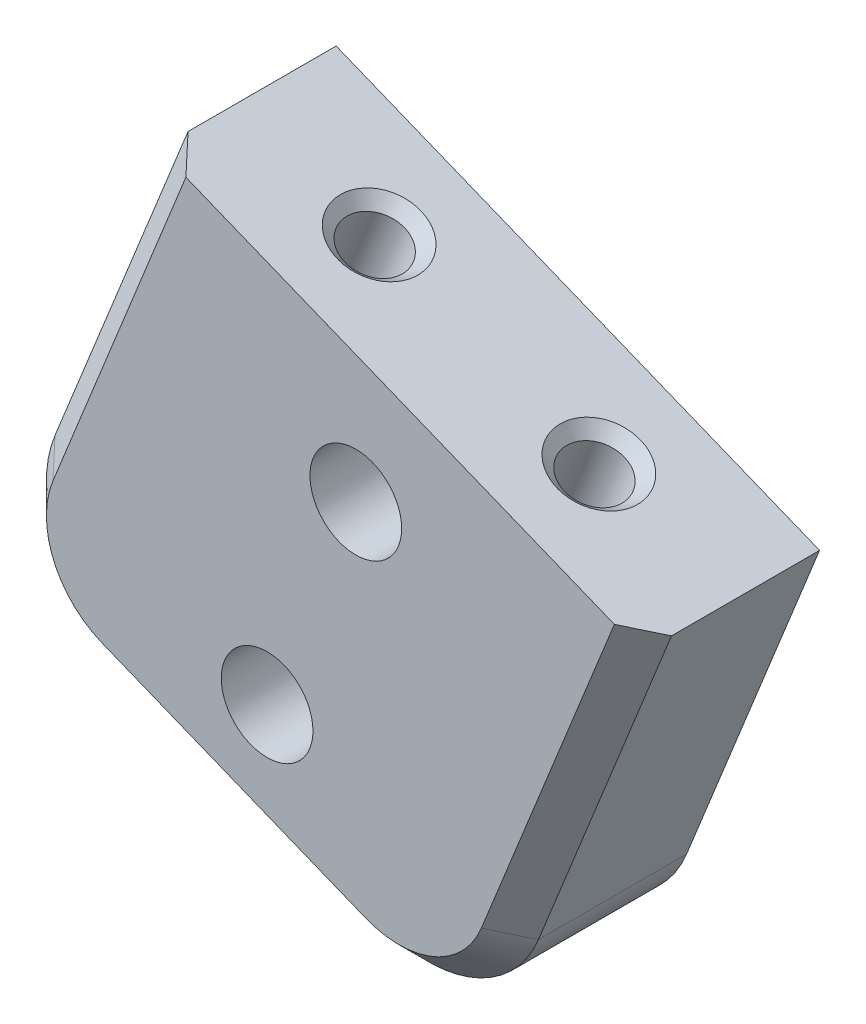
ISO-10303-21;
HEADER;
FILE_DESCRIPTION(('STEP AP214'),'2;1');
FILE_NAME('part.step','',(''),(''),'','','');
FILE_SCHEMA(('AUTOMOTIVE_DESIGN { 1 0 10303 214 1 1 1 1 }'));
ENDSEC;
DATA;
#1=APPLICATION_CONTEXT('core data for automotive mechanical design processes');
#2=APPLICATION_PROTOCOL_DEFINITION('international standard','automotive_design',2000,#1);
#3=PRODUCT_CONTEXT('',#1,'mechanical');
#4=PRODUCT('Part','Part','',(#3));
#5=PRODUCT_RELATED_PRODUCT_CATEGORY('part','',(#4));
#6=PRODUCT_DEFINITION_FORMATION('','',#4);
#7=PRODUCT_DEFINITION_CONTEXT('part definition',#1,'design');
#8=PRODUCT_DEFINITION('design','',#6,#7);
#9=PRODUCT_DEFINITION_SHAPE('','',#8);
#10=(LENGTH_UNIT() NAMED_UNIT(*) SI_UNIT(.MILLI.,.METRE.));
#11=(NAMED_UNIT(*) PLANE_ANGLE_UNIT() SI_UNIT($,.RADIAN.));
#12=(NAMED_UNIT(*) SI_UNIT($,.STERADIAN.) SOLID_ANGLE_UNIT());
#13=UNCERTAINTY_MEASURE_WITH_UNIT(LENGTH_MEASURE(1.E-05),#10,'distance_accuracy_value','');
#14=(GEOMETRIC_REPRESENTATION_CONTEXT(3) GLOBAL_UNCERTAINTY_ASSIGNED_CONTEXT((#13)) GLOBAL_UNIT_ASSIGNED_CONTEXT((#10,
#11,#12)) REPRESENTATION_CONTEXT('',''));
#15=CARTESIAN_POINT('',(0.,0.,0.));
#16=DIRECTION('',(0.,0.,1.));
#17=DIRECTION('',(1.,0.,0.));
#18=AXIS2_PLACEMENT_3D('',#15,#16,#17);
#19=CARTESIAN_POINT('',(822.963473632855,732.86364666593,9.525));
#20=DIRECTION('',(-0.37426213137974,-0.927322951843151,0.));
#21=DIRECTION('',(0.927322951843151,-0.37426213137974,0.));
#22=AXIS2_PLACEMENT_3D('',#19,#20,#21);
#23=PLANE('',#22);
#24=CARTESIAN_POINT('',(804.120271251402,740.468653175567,4.7625));
#25=DIRECTION('',(0.37426213137974,0.927322951843151,0.));
#26=DIRECTION('',(-0.927322951843151,0.37426213137974,0.));
#27=AXIS2_PLACEMENT_3D('',#24,#25,#26);
#28=CIRCLE('',#27,2.2352);
#29=CARTESIAN_POINT('',(802.047518989442,741.305203891627,4.7625));
#30=VERTEX_POINT('',#29);
#31=EDGE_CURVE('E194',#30,#30,#28,.T.);
#32=ORIENTED_EDGE('',*,*,#31,.F.);
#33=EDGE_LOOP('',(#32));
#34=FACE_BOUND('',#33,.T.);
#35=CARTESIAN_POINT('',(815.89727273981,735.715524107044,4.7625));
#36=DIRECTION('',(0.37426213137974,0.927322951843151,0.));
#37=DIRECTION('',(-0.927322951843151,0.37426213137974,0.));
#38=AXIS2_PLACEMENT_3D('',#35,#36,#37);
#39=CIRCLE('',#38,2.2352);
#40=CARTESIAN_POINT('',(813.824520477851,736.552074823104,4.7625));
#41=VERTEX_POINT('',#40);
#42=EDGE_CURVE('E213',#41,#41,#39,.T.);
#43=ORIENTED_EDGE('',*,*,#42,.F.);
#44=EDGE_LOOP('',(#43));
#45=FACE_BOUND('',#44,.T.);
#46=DIRECTION('',(0.,0.,-1.));
#47=VECTOR('',#46,1.);
#48=CARTESIAN_POINT('',(797.054070358357,743.32053061668,9.525));
#49=LINE('',#48,#47);
#50=CARTESIAN_POINT('',(797.054070358357,743.32053061668,7.9374999999999));
#51=VERTEX_POINT('',#50);
#52=CARTESIAN_POINT('',(797.054070358357,743.32053061668,0.));
#53=VERTEX_POINT('',#52);
#54=EDGE_CURVE('E110',#51,#53,#49,.T.);
#55=ORIENTED_EDGE('',*,*,#54,.F.);
#56=DIRECTION('',(0.655716347598182,-0.26464329103993,0.707106781186586));
#57=VECTOR('',#56,1.);
#58=CARTESIAN_POINT('',(798.526195544411,742.726389483114,9.52500000000304));
#59=LINE('',#58,#57);
#60=CARTESIAN_POINT('',(798.526195544408,742.726389483115,9.525));
#61=VERTEX_POINT('',#60);
#62=EDGE_CURVE('E173',#51,#61,#59,.T.);
#63=ORIENTED_EDGE('',*,*,#62,.T.);
#64=DIRECTION('',(-0.927322951843151,0.37426213137974,0.));
#65=VECTOR('',#64,1.);
#66=CARTESIAN_POINT('',(822.963473632855,732.86364666593,9.525));
#67=LINE('',#66,#65);
#68=CARTESIAN_POINT('',(821.491348446804,733.457787799496,9.525));
#69=VERTEX_POINT('',#68);
#70=EDGE_CURVE('E141',#69,#61,#67,.T.);
#71=ORIENTED_EDGE('',*,*,#70,.F.);
#72=DIRECTION('',(0.655716347598205,-0.26464329103994,-0.707106781186561));
#73=VECTOR('',#72,1.);
#74=CARTESIAN_POINT('',(821.491348446806,733.457787799495,9.52499999999783));
#75=LINE('',#74,#73);
#76=CARTESIAN_POINT('',(822.963473632855,732.86364666593,7.93749999999999));
#77=VERTEX_POINT('',#76);
#78=EDGE_CURVE('E171',#69,#77,#75,.T.);
#79=ORIENTED_EDGE('',*,*,#78,.T.);
#80=DIRECTION('',(0.,0.,-1.));
#81=VECTOR('',#80,1.);
#82=CARTESIAN_POINT('',(822.963473632855,732.86364666593,9.525));
#83=LINE('',#82,#81);
#84=CARTESIAN_POINT('',(822.963473632855,732.86364666593,0.));
#85=VERTEX_POINT('',#84);
#86=EDGE_CURVE('E122',#77,#85,#83,.T.);
#87=ORIENTED_EDGE('',*,*,#86,.T.);
#88=DIRECTION('',(-0.927322951843151,0.37426213137974,0.));
#89=VECTOR('',#88,1.);
#90=CARTESIAN_POINT('',(822.963473632855,732.86364666593,0.));
#91=LINE('',#90,#89);
#92=EDGE_CURVE('E129',#85,#53,#91,.T.);
#93=ORIENTED_EDGE('',*,*,#92,.T.);
#94=EDGE_LOOP('',(#55,#63,#71,#79,#87,#93));
#95=FACE_BOUND('',#94,.T.);
#96=ADVANCED_FACE('F37',(#34,#45,#95),#23,.F.);
#97=CARTESIAN_POINT('',(797.054070358357,743.32053061668,9.525));
#98=DIRECTION('',(0.927322951843153,-0.374262131379735,0.));
#99=DIRECTION('',(0.374262131379735,0.927322951843153,0.));
#100=AXIS2_PLACEMENT_3D('',#97,#98,#99);
#101=PLANE('',#100);
#102=DIRECTION('',(0.,0.,-1.));
#103=VECTOR('',#102,1.);
#104=CARTESIAN_POINT('',(789.924376755573,725.655028384068,9.525));
#105=LINE('',#104,#103);
#106=CARTESIAN_POINT('',(789.924376755573,725.655028384068,0.));
#107=VERTEX_POINT('',#106);
#108=CARTESIAN_POINT('',(789.924376755573,725.655028384068,7.93749999999992));
#109=VERTEX_POINT('',#108);
#110=EDGE_CURVE('E155',#107,#109,#105,.F.);
#111=ORIENTED_EDGE('',*,*,#110,.T.);
#112=DIRECTION('',(0.374262131379735,0.927322951843153,0.));
#113=VECTOR('',#112,1.);
#114=CARTESIAN_POINT('',(797.054070358357,743.32053061668,7.9374999999999));
#115=LINE('',#114,#113);
#116=EDGE_CURVE('E117',#109,#51,#115,.T.);
#117=ORIENTED_EDGE('',*,*,#116,.T.);
#118=ORIENTED_EDGE('',*,*,#54,.T.);
#119=DIRECTION('',(-0.374262131379735,-0.927322951843153,0.));
#120=VECTOR('',#119,1.);
#121=CARTESIAN_POINT('',(797.054070358357,743.32053061668,0.));
#122=LINE('',#121,#120);
#123=EDGE_CURVE('E114',#53,#107,#122,.T.);
#124=ORIENTED_EDGE('',*,*,#123,.T.);
#125=EDGE_LOOP('',(#111,#117,#118,#124));
#126=FACE_BOUND('',#125,.T.);
#127=ADVANCED_FACE('F113',(#126),#101,.F.);
#128=CARTESIAN_POINT('',(813.45721549581,709.309643689114,9.525));
#129=DIRECTION('',(0.374262131379737,0.927322951843152,0.));
#130=DIRECTION('',(-0.927322951843152,0.374262131379737,0.));
#131=AXIS2_PLACEMENT_3D('',#128,#129,#130);
#132=PLANE('',#131);
#133=CARTESIAN_POINT('',(794.614013114357,716.914650198751,4.7625));
#134=DIRECTION('',(0.374262131379737,0.927322951843152,0.));
#135=DIRECTION('',(-0.927322951843152,0.374262131379737,0.));
#136=AXIS2_PLACEMENT_3D('',#133,#134,#135);
#137=CIRCLE('',#136,0.793749999999991);
#138=CARTESIAN_POINT('',(793.877950521331,717.211720765533,4.7625));
#139=VERTEX_POINT('',#138);
#140=EDGE_CURVE('E190',#139,#139,#137,.T.);
#141=ORIENTED_EDGE('',*,*,#140,.T.);
#142=EDGE_LOOP('',(#141));
#143=FACE_BOUND('',#142,.T.);
#144=CARTESIAN_POINT('',(806.391014602765,712.161521130228,4.7625));
#145=DIRECTION('',(0.374262131379737,0.927322951843152,0.));
#146=DIRECTION('',(-0.927322951843152,0.374262131379737,0.));
#147=AXIS2_PLACEMENT_3D('',#144,#145,#146);
#148=CIRCLE('',#147,0.793749999999991);
#149=CARTESIAN_POINT('',(805.654952009739,712.458591697011,4.7625));
#150=VERTEX_POINT('',#149);
#151=EDGE_CURVE('E189',#150,#150,#148,.T.);
#152=ORIENTED_EDGE('',*,*,#151,.T.);
#153=EDGE_LOOP('',(#152));
#154=FACE_BOUND('',#153,.T.);
#155=DIRECTION('',(0.,0.,-1.));
#156=VECTOR('',#155,1.);
#157=CARTESIAN_POINT('',(807.568714751606,711.686208223376,9.525));
#158=LINE('',#157,#156);
#159=CARTESIAN_POINT('',(807.568714751606,711.686208223376,0.));
#160=VERTEX_POINT('',#159);
#161=CARTESIAN_POINT('',(807.568714751606,711.686208223376,7.93749999999992));
#162=VERTEX_POINT('',#161);
#163=EDGE_CURVE('E121',#160,#162,#158,.F.);
#164=ORIENTED_EDGE('',*,*,#163,.T.);
#165=DIRECTION('',(-0.927322951843152,0.374262131379737,0.));
#166=VECTOR('',#165,1.);
#167=CARTESIAN_POINT('',(793.436312965516,717.389963105603,7.93749999999992));
#168=LINE('',#167,#166);
#169=CARTESIAN_POINT('',(793.436312965516,717.389963105603,7.93749999999992));
#170=VERTEX_POINT('',#169);
#171=EDGE_CURVE('E177',#162,#170,#168,.T.);
#172=ORIENTED_EDGE('',*,*,#171,.T.);
#173=DIRECTION('',(0.,0.,-1.));
#174=VECTOR('',#173,1.);
#175=CARTESIAN_POINT('',(793.436312965516,717.389963105603,9.525));
#176=LINE('',#175,#174);
#177=CARTESIAN_POINT('',(793.436312965516,717.389963105603,0.));
#178=VERTEX_POINT('',#177);
#179=EDGE_CURVE('E150',#170,#178,#176,.T.);
#180=ORIENTED_EDGE('',*,*,#179,.T.);
#181=DIRECTION('',(0.927322951843152,-0.374262131379737,0.));
#182=VECTOR('',#181,1.);
#183=CARTESIAN_POINT('',(813.45721549581,709.309643689114,0.));
#184=LINE('',#183,#182);
#185=EDGE_CURVE('E132',#178,#160,#184,.T.);
#186=ORIENTED_EDGE('',*,*,#185,.T.);
#187=EDGE_LOOP('',(#164,#172,#180,#186));
#188=FACE_BOUND('',#187,.T.);
#189=ADVANCED_FACE('F242',(#143,#154,#188),#132,.F.);
#190=CARTESIAN_POINT('',(822.963473632855,732.86364666593,9.525));
#191=DIRECTION('',(-0.927322951843152,0.374262131379736,0.));
#192=DIRECTION('',(-0.374262131379736,-0.927322951843152,0.));
#193=AXIS2_PLACEMENT_3D('',#190,#191,#192);
#194=PLANE('',#193);
#195=ORIENTED_EDGE('',*,*,#86,.F.);
#196=DIRECTION('',(-0.374262131379736,-0.927322951843152,0.));
#197=VECTOR('',#196,1.);
#198=CARTESIAN_POINT('',(815.833780030071,715.198144433318,7.93749999999999));
#199=LINE('',#198,#197);
#200=CARTESIAN_POINT('',(815.833780030071,715.198144433318,7.93749999999999));
#201=VERTEX_POINT('',#200);
#202=EDGE_CURVE('E11',#77,#201,#199,.T.);
#203=ORIENTED_EDGE('',*,*,#202,.T.);
#204=DIRECTION('',(0.,0.,-1.));
#205=VECTOR('',#204,1.);
#206=CARTESIAN_POINT('',(815.833780030071,715.198144433318,9.525));
#207=LINE('',#206,#205);
#208=CARTESIAN_POINT('',(815.833780030071,715.198144433318,0.));
#209=VERTEX_POINT('',#208);
#210=EDGE_CURVE('E157',#201,#209,#207,.T.);
#211=ORIENTED_EDGE('',*,*,#210,.T.);
#212=DIRECTION('',(0.374262131379736,0.927322951843152,0.));
#213=VECTOR('',#212,1.);
#214=CARTESIAN_POINT('',(822.963473632855,732.86364666593,0.));
#215=LINE('',#214,#213);
#216=EDGE_CURVE('E146',#209,#85,#215,.T.);
#217=ORIENTED_EDGE('',*,*,#216,.T.);
#218=EDGE_LOOP('',(#195,#203,#211,#217));
#219=FACE_BOUND('',#218,.T.);
#220=ADVANCED_FACE('F303',(#219),#194,.F.);
#221=CARTESIAN_POINT('',(0.,0.,9.525));
#222=DIRECTION('',(0.,0.,1.));
#223=DIRECTION('',(1.,0.,0.));
#224=AXIS2_PLACEMENT_3D('',#221,#222,#223);
#225=PLANE('',#224);
#226=CARTESIAN_POINT('',(807.632207461345,732.203587897101,9.525));
#227=DIRECTION('',(0.,0.,1.));
#228=DIRECTION('',(1.,0.,0.));
#229=AXIS2_PLACEMENT_3D('',#226,#227,#228);
#230=CIRCLE('',#229,2.45744999999997);
#231=CARTESIAN_POINT('',(810.089657461345,732.203587897101,9.525));
#232=VERTEX_POINT('',#231);
#233=EDGE_CURVE('E353',#232,#232,#230,.T.);
#234=ORIENTED_EDGE('',*,*,#233,.F.);
#235=EDGE_LOOP('',(#234));
#236=FACE_BOUND('',#235,.T.);
#237=CARTESIAN_POINT('',(802.879078392822,720.426586408693,9.525));
#238=DIRECTION('',(0.,0.,1.));
#239=DIRECTION('',(1.,0.,0.));
#240=AXIS2_PLACEMENT_3D('',#237,#238,#239);
#241=CIRCLE('',#240,2.45744999999997);
#242=CARTESIAN_POINT('',(805.336528392822,720.426586408693,9.525));
#243=VERTEX_POINT('',#242);
#244=EDGE_CURVE('E355',#243,#243,#241,.T.);
#245=ORIENTED_EDGE('',*,*,#244,.F.);
#246=EDGE_LOOP('',(#245));
#247=FACE_BOUND('',#246,.T.);
#248=ORIENTED_EDGE('',*,*,#70,.T.);
#249=DIRECTION('',(-0.374262131379735,-0.927322951843153,0.));
#250=VECTOR('',#249,1.);
#251=CARTESIAN_POINT('',(791.396501941624,725.060887250503,9.525));
#252=LINE('',#251,#250);
#253=CARTESIAN_POINT('',(791.396501941624,725.060887250503,9.525));
#254=VERTEX_POINT('',#253);
#255=EDGE_CURVE('E167',#61,#254,#252,.T.);
#256=ORIENTED_EDGE('',*,*,#255,.T.);
#257=CARTESIAN_POINT('',(795.812877499777,723.278463849807,9.525));
#258=DIRECTION('',(0.,0.,1.));
#259=DIRECTION('',(1.,0.,0.));
#260=AXIS2_PLACEMENT_3D('',#257,#258,#259);
#261=CIRCLE('',#260,4.76249999999999);
#262=CARTESIAN_POINT('',(794.030454099081,718.862088291654,9.525));
#263=VERTEX_POINT('',#262);
#264=EDGE_CURVE('E165',#254,#263,#261,.T.);
#265=ORIENTED_EDGE('',*,*,#264,.T.);
#266=DIRECTION('',(0.927322951843152,-0.374262131379737,0.));
#267=VECTOR('',#266,1.);
#268=CARTESIAN_POINT('',(808.162855885171,713.158333409427,9.525));
#269=LINE('',#268,#267);
#270=CARTESIAN_POINT('',(808.162855885171,713.158333409427,9.525));
#271=VERTEX_POINT('',#270);
#272=EDGE_CURVE('E163',#263,#271,#269,.T.);
#273=ORIENTED_EDGE('',*,*,#272,.T.);
#274=CARTESIAN_POINT('',(809.945279285867,717.57470896758,9.525));
#275=DIRECTION('',(0.,0.,1.));
#276=DIRECTION('',(1.,0.,0.));
#277=AXIS2_PLACEMENT_3D('',#274,#275,#276);
#278=CIRCLE('',#277,4.76249999999999);
#279=CARTESIAN_POINT('',(814.36165484402,715.792285566884,9.525));
#280=VERTEX_POINT('',#279);
#281=EDGE_CURVE('E161',#271,#280,#278,.T.);
#282=ORIENTED_EDGE('',*,*,#281,.T.);
#283=DIRECTION('',(0.374262131379736,0.927322951843152,0.));
#284=VECTOR('',#283,1.);
#285=CARTESIAN_POINT('',(821.491348446804,733.457787799496,9.525));
#286=LINE('',#285,#284);
#287=EDGE_CURVE('E159',#280,#69,#286,.T.);
#288=ORIENTED_EDGE('',*,*,#287,.T.);
#289=EDGE_LOOP('',(#248,#256,#265,#273,#282,#288));
#290=FACE_BOUND('',#289,.T.);
#291=ADVANCED_FACE('F292',(#236,#247,#290),#225,.T.);
#292=CARTESIAN_POINT('',(0.,0.,0.));
#293=DIRECTION('',(0.,0.,1.));
#294=DIRECTION('',(1.,0.,0.));
#295=AXIS2_PLACEMENT_3D('',#292,#293,#294);
#296=PLANE('',#295);
#297=CARTESIAN_POINT('',(807.632207461345,732.203587897101,0.));
#298=DIRECTION('',(0.,0.,1.));
#299=DIRECTION('',(1.,0.,0.));
#300=AXIS2_PLACEMENT_3D('',#297,#298,#299);
#301=CIRCLE('',#300,2.45744999999997);
#302=CARTESIAN_POINT('',(810.089657461345,732.203587897101,0.));
#303=VERTEX_POINT('',#302);
#304=EDGE_CURVE('E350',#303,#303,#301,.T.);
#305=ORIENTED_EDGE('',*,*,#304,.T.);
#306=EDGE_LOOP('',(#305));
#307=FACE_BOUND('',#306,.T.);
#308=CARTESIAN_POINT('',(802.879078392822,720.426586408693,0.));
#309=DIRECTION('',(0.,0.,1.));
#310=DIRECTION('',(1.,0.,0.));
#311=AXIS2_PLACEMENT_3D('',#308,#309,#310);
#312=CIRCLE('',#311,2.45744999999997);
#313=CARTESIAN_POINT('',(805.336528392822,720.426586408693,0.));
#314=VERTEX_POINT('',#313);
#315=EDGE_CURVE('E201',#314,#314,#312,.T.);
#316=ORIENTED_EDGE('',*,*,#315,.T.);
#317=EDGE_LOOP('',(#316));
#318=FACE_BOUND('',#317,.T.);
#319=ORIENTED_EDGE('',*,*,#185,.F.);
#320=CARTESIAN_POINT('',(795.812877499777,723.278463849807,0.));
#321=DIRECTION('',(0.,0.,1.));
#322=DIRECTION('',(1.,0.,0.));
#323=AXIS2_PLACEMENT_3D('',#320,#321,#322);
#324=CIRCLE('',#323,6.35);
#325=EDGE_CURVE('E131',#178,#107,#324,.F.);
#326=ORIENTED_EDGE('',*,*,#325,.T.);
#327=ORIENTED_EDGE('',*,*,#123,.F.);
#328=ORIENTED_EDGE('',*,*,#92,.F.);
#329=ORIENTED_EDGE('',*,*,#216,.F.);
#330=CARTESIAN_POINT('',(809.945279285867,717.57470896758,0.));
#331=DIRECTION('',(0.,0.,1.));
#332=DIRECTION('',(1.,0.,0.));
#333=AXIS2_PLACEMENT_3D('',#330,#331,#332);
#334=CIRCLE('',#333,6.35);
#335=EDGE_CURVE('E152',#209,#160,#334,.F.);
#336=ORIENTED_EDGE('',*,*,#335,.T.);
#337=EDGE_LOOP('',(#319,#326,#327,#328,#329,#336));
#338=FACE_BOUND('',#337,.T.);
#339=ADVANCED_FACE('F127',(#307,#318,#338),#296,.F.);
#340=CARTESIAN_POINT('',(795.812877499777,723.278463849807,9.525));
#341=DIRECTION('',(0.,0.,-1.));
#342=DIRECTION('',(-1.,0.,0.));
#343=AXIS2_PLACEMENT_3D('',#340,#341,#342);
#344=CYLINDRICAL_SURFACE('',#343,6.35);
#345=ORIENTED_EDGE('',*,*,#179,.F.);
#346=CARTESIAN_POINT('',(795.812877499777,723.278463849807,7.93749999999992));
#347=DIRECTION('',(0.,0.,1.));
#348=DIRECTION('',(1.,0.,0.));
#349=AXIS2_PLACEMENT_3D('',#346,#347,#348);
#350=CIRCLE('',#349,6.35);
#351=EDGE_CURVE('E175',#170,#109,#350,.F.);
#352=ORIENTED_EDGE('',*,*,#351,.T.);
#353=ORIENTED_EDGE('',*,*,#110,.F.);
#354=ORIENTED_EDGE('',*,*,#325,.F.);
#355=EDGE_LOOP('',(#345,#352,#353,#354));
#356=FACE_BOUND('',#355,.T.);
#357=ADVANCED_FACE('F247',(#356),#344,.T.);
#358=CARTESIAN_POINT('',(809.945279285867,717.57470896758,9.525));
#359=DIRECTION('',(0.,0.,-1.));
#360=DIRECTION('',(-1.,0.,0.));
#361=AXIS2_PLACEMENT_3D('',#358,#359,#360);
#362=CYLINDRICAL_SURFACE('',#361,6.35);
#363=ORIENTED_EDGE('',*,*,#210,.F.);
#364=CARTESIAN_POINT('',(809.945279285867,717.57470896758,7.93749999999992));
#365=DIRECTION('',(0.,0.,1.));
#366=DIRECTION('',(1.,0.,0.));
#367=AXIS2_PLACEMENT_3D('',#364,#365,#366);
#368=CIRCLE('',#367,6.35);
#369=EDGE_CURVE('E47',#201,#162,#368,.F.);
#370=ORIENTED_EDGE('',*,*,#369,.T.);
#371=ORIENTED_EDGE('',*,*,#163,.F.);
#372=ORIENTED_EDGE('',*,*,#335,.F.);
#373=EDGE_LOOP('',(#363,#370,#371,#372));
#374=FACE_BOUND('',#373,.T.);
#375=ADVANCED_FACE('F250',(#374),#362,.T.);
#376=CARTESIAN_POINT('',(451.86806750885,-182.371314882444,9.525));
#377=DIRECTION('',(0.655716347598232,-0.264643291039947,0.707106781186534));
#378=DIRECTION('',(-0.374262131379736,-0.927322951843152,0.));
#379=AXIS2_PLACEMENT_3D('',#376,#377,#378);
#380=PLANE('',#379);
#381=ORIENTED_EDGE('',*,*,#78,.F.);
#382=ORIENTED_EDGE('',*,*,#287,.F.);
#383=DIRECTION('',(-0.655716347598212,0.264643291039959,0.707106781186548));
#384=VECTOR('',#383,1.);
#385=CARTESIAN_POINT('',(815.833780030071,715.198144433318,7.93749999999999));
#386=LINE('',#385,#384);
#387=EDGE_CURVE('E135',#201,#280,#386,.T.);
#388=ORIENTED_EDGE('',*,*,#387,.F.);
#389=ORIENTED_EDGE('',*,*,#202,.F.);
#390=EDGE_LOOP('',(#381,#382,#388,#389));
#391=FACE_BOUND('',#390,.T.);
#392=ADVANCED_FACE('F40',(#391),#380,.T.);
#393=CARTESIAN_POINT('',(809.945279285867,717.57470896758,9.525));
#394=DIRECTION('',(0.,0.,-1.));
#395=DIRECTION('',(-1.,0.,0.));
#396=AXIS2_PLACEMENT_3D('',#393,#394,#395);
#397=CONICAL_SURFACE('',#396,4.76249999999999,0.785398163397425);
#398=ORIENTED_EDGE('',*,*,#387,.T.);
#399=ORIENTED_EDGE('',*,*,#281,.F.);
#400=DIRECTION('',(0.264643291039953,0.655716347598198,0.707106781186563));
#401=VECTOR('',#400,1.);
#402=CARTESIAN_POINT('',(807.568714751606,711.686208223376,7.93749999999992));
#403=LINE('',#402,#401);
#404=EDGE_CURVE('E138',#162,#271,#403,.T.);
#405=ORIENTED_EDGE('',*,*,#404,.F.);
#406=ORIENTED_EDGE('',*,*,#369,.F.);
#407=EDGE_LOOP('',(#398,#399,#405,#406));
#408=FACE_BOUND('',#407,.T.);
#409=ADVANCED_FACE('F274',(#408),#397,.T.);
#410=CARTESIAN_POINT('',(360.711163934474,893.747224891175,9.525));
#411=DIRECTION('',(-0.264643291039943,-0.65571634759822,0.707106781186546));
#412=DIRECTION('',(-0.927322951843152,0.374262131379737,0.));
#413=AXIS2_PLACEMENT_3D('',#410,#411,#412);
#414=PLANE('',#413);
#415=ORIENTED_EDGE('',*,*,#404,.T.);
#416=ORIENTED_EDGE('',*,*,#272,.F.);
#417=DIRECTION('',(0.264643291039953,0.655716347598198,0.707106781186563));
#418=VECTOR('',#417,1.);
#419=CARTESIAN_POINT('',(793.436312965516,717.389963105603,7.93749999999992));
#420=LINE('',#419,#418);
#421=EDGE_CURVE('E182',#170,#263,#420,.T.);
#422=ORIENTED_EDGE('',*,*,#421,.F.);
#423=ORIENTED_EDGE('',*,*,#171,.F.);
#424=EDGE_LOOP('',(#415,#416,#422,#423));
#425=FACE_BOUND('',#424,.T.);
#426=ADVANCED_FACE('F268',(#425),#414,.T.);
#427=CARTESIAN_POINT('',(795.812877499777,723.278463849807,9.525));
#428=DIRECTION('',(0.,0.,-1.));
#429=DIRECTION('',(-1.,0.,0.));
#430=AXIS2_PLACEMENT_3D('',#427,#428,#429);
#431=CONICAL_SURFACE('',#430,4.76249999999995,0.785398163397438);
#432=ORIENTED_EDGE('',*,*,#421,.T.);
#433=ORIENTED_EDGE('',*,*,#264,.F.);
#434=DIRECTION('',(0.655716347598198,-0.264643291039953,0.707106781186563));
#435=VECTOR('',#434,1.);
#436=CARTESIAN_POINT('',(789.924376755573,725.655028384068,7.93749999999992));
#437=LINE('',#436,#435);
#438=EDGE_CURVE('E180',#109,#254,#437,.T.);
#439=ORIENTED_EDGE('',*,*,#438,.F.);
#440=ORIENTED_EDGE('',*,*,#351,.F.);
#441=EDGE_LOOP('',(#432,#433,#439,#440));
#442=FACE_BOUND('',#441,.T.);
#443=ADVANCED_FACE('F261',(#442),#431,.T.);
#444=CARTESIAN_POINT('',(428.902914606456,-173.102713198825,9.525));
#445=DIRECTION('',(-0.655716347598255,0.264643291039955,0.707106781186509));
#446=DIRECTION('',(0.374262131379735,0.927322951843153,0.));
#447=AXIS2_PLACEMENT_3D('',#444,#445,#446);
#448=PLANE('',#447);
#449=ORIENTED_EDGE('',*,*,#62,.F.);
#450=ORIENTED_EDGE('',*,*,#116,.F.);
#451=ORIENTED_EDGE('',*,*,#438,.T.);
#452=ORIENTED_EDGE('',*,*,#255,.F.);
#453=EDGE_LOOP('',(#449,#450,#451,#452));
#454=FACE_BOUND('',#453,.T.);
#455=ADVANCED_FACE('F255',(#454),#448,.T.);
#456=CARTESIAN_POINT('',(811.738284804853,725.410647804687,4.7625));
#457=DIRECTION('',(0.37426213137974,0.927322951843151,0.));
#458=DIRECTION('',(-0.927322951843151,0.37426213137974,0.));
#459=AXIS2_PLACEMENT_3D('',#456,#457,#458);
#460=CONICAL_SURFACE('',#459,1.60019999999999,1.02974425867667);
#461=CARTESIAN_POINT('',(811.556930832127,724.961300442994,4.7625));
#462=DIRECTION('',(0.37426213137974,0.927322951843151,0.));
#463=DIRECTION('',(-0.927322951843151,0.37426213137974,0.));
#464=AXIS2_PLACEMENT_3D('',#461,#462,#463);
#465=CIRCLE('',#464,0.793749999999991);
#466=CARTESIAN_POINT('',(810.820868239101,725.258371009777,4.7625));
#467=VERTEX_POINT('',#466);
#468=EDGE_CURVE('E187',#467,#467,#465,.F.);
#469=ORIENTED_EDGE('',*,*,#468,.T.);
#470=EDGE_LOOP('',(#469));
#471=FACE_BOUND('',#470,.T.);
#472=CARTESIAN_POINT('',(811.738284804853,725.410647804687,4.7625));
#473=DIRECTION('',(0.37426213137974,0.927322951843151,0.));
#474=DIRECTION('',(-0.927322951843151,0.37426213137974,0.));
#475=AXIS2_PLACEMENT_3D('',#472,#473,#474);
#476=CIRCLE('',#475,1.60019999999999);
#477=CARTESIAN_POINT('',(810.254382617314,726.009542067321,4.7625));
#478=VERTEX_POINT('',#477);
#479=EDGE_CURVE('E183',#478,#478,#476,.T.);
#480=ORIENTED_EDGE('',*,*,#479,.T.);
#481=EDGE_LOOP('',(#480));
#482=FACE_BOUND('',#481,.T.);
#483=ADVANCED_FACE('F221',(#471,#482),#460,.F.);
#484=CARTESIAN_POINT('',(815.89727273981,735.715524107044,4.7625));
#485=DIRECTION('',(0.37426213137974,0.927322951843151,0.));
#486=DIRECTION('',(-0.927322951843151,0.37426213137974,0.));
#487=AXIS2_PLACEMENT_3D('',#484,#485,#486);
#488=CYLINDRICAL_SURFACE('',#487,1.6002);
#489=ORIENTED_EDGE('',*,*,#479,.F.);
#490=EDGE_LOOP('',(#489));
#491=FACE_BOUND('',#490,.T.);
#492=CARTESIAN_POINT('',(815.659616286384,735.126674032624,4.7625));
#493=DIRECTION('',(0.37426213137974,0.927322951843151,0.));
#494=DIRECTION('',(-0.927322951843151,0.37426213137974,0.));
#495=AXIS2_PLACEMENT_3D('',#492,#493,#494);
#496=CIRCLE('',#495,1.6002);
#497=CARTESIAN_POINT('',(814.175714098845,735.725568295258,4.7625));
#498=VERTEX_POINT('',#497);
#499=EDGE_CURVE('E216',#498,#498,#496,.T.);
#500=ORIENTED_EDGE('',*,*,#499,.T.);
#501=EDGE_LOOP('',(#500));
#502=FACE_BOUND('',#501,.T.);
#503=ADVANCED_FACE('F223',(#491,#502),#488,.F.);
#504=CARTESIAN_POINT('',(815.89727273981,735.715524107044,4.7625));
#505=DIRECTION('',(0.37426213137974,0.927322951843151,0.));
#506=DIRECTION('',(-0.927322951843151,0.37426213137974,0.));
#507=AXIS2_PLACEMENT_3D('',#504,#505,#506);
#508=CONICAL_SURFACE('',#507,2.2352,0.785398163397426);
#509=ORIENTED_EDGE('',*,*,#499,.F.);
#510=EDGE_LOOP('',(#509));
#511=FACE_BOUND('',#510,.T.);
#512=ORIENTED_EDGE('',*,*,#42,.T.);
#513=EDGE_LOOP('',(#512));
#514=FACE_BOUND('',#513,.T.);
#515=ADVANCED_FACE('F226',(#511,#514),#508,.F.);
#516=CARTESIAN_POINT('',(799.961283316445,730.16377687321,4.7625));
#517=DIRECTION('',(0.37426213137974,0.927322951843151,0.));
#518=DIRECTION('',(-0.927322951843151,0.37426213137974,0.));
#519=AXIS2_PLACEMENT_3D('',#516,#517,#518);
#520=CONICAL_SURFACE('',#519,1.60019999999999,1.02974425867667);
#521=CARTESIAN_POINT('',(799.779929343719,729.714429511517,4.7625));
#522=DIRECTION('',(0.37426213137974,0.927322951843151,0.));
#523=DIRECTION('',(-0.927322951843151,0.37426213137974,0.));
#524=AXIS2_PLACEMENT_3D('',#521,#522,#523);
#525=CIRCLE('',#524,0.793749999999991);
#526=CARTESIAN_POINT('',(799.043866750693,730.0115000783,4.7625));
#527=VERTEX_POINT('',#526);
#528=EDGE_CURVE('E42',#527,#527,#525,.F.);
#529=ORIENTED_EDGE('',*,*,#528,.T.);
#530=EDGE_LOOP('',(#529));
#531=FACE_BOUND('',#530,.T.);
#532=CARTESIAN_POINT('',(799.961283316445,730.16377687321,4.7625));
#533=DIRECTION('',(0.37426213137974,0.927322951843151,0.));
#534=DIRECTION('',(-0.927322951843151,0.37426213137974,0.));
#535=AXIS2_PLACEMENT_3D('',#532,#533,#534);
#536=CIRCLE('',#535,1.60019999999999);
#537=CARTESIAN_POINT('',(798.477381128906,730.762671135844,4.7625));
#538=VERTEX_POINT('',#537);
#539=EDGE_CURVE('E210',#538,#538,#536,.T.);
#540=ORIENTED_EDGE('',*,*,#539,.T.);
#541=EDGE_LOOP('',(#540));
#542=FACE_BOUND('',#541,.T.);
#543=ADVANCED_FACE('F232',(#531,#542),#520,.F.);
#544=CARTESIAN_POINT('',(804.120271251402,740.468653175567,4.7625));
#545=DIRECTION('',(0.37426213137974,0.927322951843151,0.));
#546=DIRECTION('',(-0.927322951843151,0.37426213137974,0.));
#547=AXIS2_PLACEMENT_3D('',#544,#545,#546);
#548=CYLINDRICAL_SURFACE('',#547,1.6002);
#549=ORIENTED_EDGE('',*,*,#539,.F.);
#550=EDGE_LOOP('',(#549));
#551=FACE_BOUND('',#550,.T.);
#552=CARTESIAN_POINT('',(803.882614797976,739.879803101146,4.7625));
#553=DIRECTION('',(0.37426213137974,0.927322951843151,0.));
#554=DIRECTION('',(-0.927322951843151,0.37426213137974,0.));
#555=AXIS2_PLACEMENT_3D('',#552,#553,#554);
#556=CIRCLE('',#555,1.6002);
#557=CARTESIAN_POINT('',(802.398712610437,740.47869736378,4.7625));
#558=VERTEX_POINT('',#557);
#559=EDGE_CURVE('E207',#558,#558,#556,.T.);
#560=ORIENTED_EDGE('',*,*,#559,.T.);
#561=EDGE_LOOP('',(#560));
#562=FACE_BOUND('',#561,.T.);
#563=ADVANCED_FACE('F321',(#551,#562),#548,.F.);
#564=CARTESIAN_POINT('',(804.120271251402,740.468653175567,4.7625));
#565=DIRECTION('',(0.37426213137974,0.927322951843151,0.));
#566=DIRECTION('',(-0.927322951843151,0.37426213137974,0.));
#567=AXIS2_PLACEMENT_3D('',#564,#565,#566);
#568=CONICAL_SURFACE('',#567,2.2352,0.785398163397426);
#569=ORIENTED_EDGE('',*,*,#559,.F.);
#570=EDGE_LOOP('',(#569));
#571=FACE_BOUND('',#570,.T.);
#572=ORIENTED_EDGE('',*,*,#31,.T.);
#573=EDGE_LOOP('',(#572));
#574=FACE_BOUND('',#573,.T.);
#575=ADVANCED_FACE('F325',(#571,#574),#568,.F.);
#576=CARTESIAN_POINT('',(815.89727273981,735.715524107044,4.7625));
#577=DIRECTION('',(0.37426213137974,0.927322951843151,0.));
#578=DIRECTION('',(-0.927322951843151,0.37426213137974,0.));
#579=AXIS2_PLACEMENT_3D('',#576,#577,#578);
#580=CYLINDRICAL_SURFACE('',#579,0.793749999999991);
#581=ORIENTED_EDGE('',*,*,#468,.F.);
#582=EDGE_LOOP('',(#581));
#583=FACE_BOUND('',#582,.T.);
#584=ORIENTED_EDGE('',*,*,#151,.F.);
#585=EDGE_LOOP('',(#584));
#586=FACE_BOUND('',#585,.T.);
#587=ADVANCED_FACE('F329',(#583,#586),#580,.F.);
#588=CARTESIAN_POINT('',(804.120271251402,740.468653175567,4.7625));
#589=DIRECTION('',(0.37426213137974,0.927322951843151,0.));
#590=DIRECTION('',(-0.927322951843151,0.37426213137974,0.));
#591=AXIS2_PLACEMENT_3D('',#588,#589,#590);
#592=CYLINDRICAL_SURFACE('',#591,0.793749999999991);
#593=ORIENTED_EDGE('',*,*,#528,.F.);
#594=EDGE_LOOP('',(#593));
#595=FACE_BOUND('',#594,.T.);
#596=ORIENTED_EDGE('',*,*,#140,.F.);
#597=EDGE_LOOP('',(#596));
#598=FACE_BOUND('',#597,.T.);
#599=ADVANCED_FACE('F333',(#595,#598),#592,.F.);
#600=CARTESIAN_POINT('',(802.879078392822,720.426586408693,9.525));
#601=DIRECTION('',(0.,0.,1.));
#602=DIRECTION('',(1.,0.,0.));
#603=AXIS2_PLACEMENT_3D('',#600,#601,#602);
#604=CYLINDRICAL_SURFACE('',#603,2.45744999999997);
#605=ORIENTED_EDGE('',*,*,#315,.F.);
#606=EDGE_LOOP('',(#605));
#607=FACE_BOUND('',#606,.T.);
#608=ORIENTED_EDGE('',*,*,#244,.T.);
#609=EDGE_LOOP('',(#608));
#610=FACE_BOUND('',#609,.T.);
#611=ADVANCED_FACE('F337',(#607,#610),#604,.F.);
#612=CARTESIAN_POINT('',(807.632207461345,732.203587897101,9.525));
#613=DIRECTION('',(0.,0.,1.));
#614=DIRECTION('',(1.,0.,0.));
#615=AXIS2_PLACEMENT_3D('',#612,#613,#614);
#616=CYLINDRICAL_SURFACE('',#615,2.45744999999997);
#617=ORIENTED_EDGE('',*,*,#304,.F.);
#618=EDGE_LOOP('',(#617));
#619=FACE_BOUND('',#618,.T.);
#620=ORIENTED_EDGE('',*,*,#233,.T.);
#621=EDGE_LOOP('',(#620));
#622=FACE_BOUND('',#621,.T.);
#623=ADVANCED_FACE('F341',(#619,#622),#616,.F.);
#624=CLOSED_SHELL('',(#96,#127,#189,#220,#291,#339,#357,#375,#392,#409,#426,#443,#455,#483,#503,
#515,#543,#563,#575,#587,#599,#611,#623));
#625=MANIFOLD_SOLID_BREP('B2',#624);
#626=ADVANCED_BREP_SHAPE_REPRESENTATION('',(#18,#625),#14);
#627=SHAPE_DEFINITION_REPRESENTATION(#9,#626);
ENDSEC;
END-ISO-10303-21;
